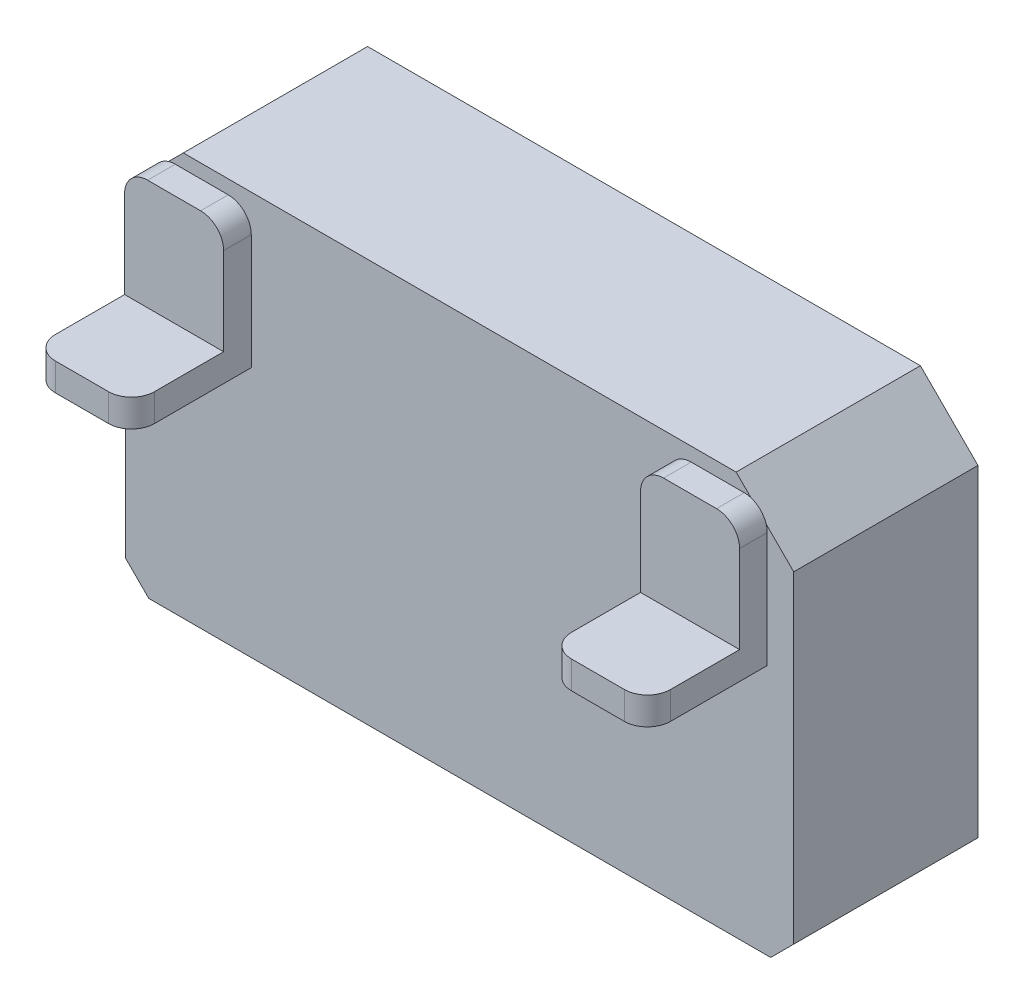
ISO-10303-21;
HEADER;
FILE_DESCRIPTION(('STEP AP214'),'2;1');
FILE_NAME('part.step','',(''),(''),'','','');
FILE_SCHEMA(('AUTOMOTIVE_DESIGN { 1 0 10303 214 1 1 1 1 }'));
ENDSEC;
DATA;
#1=APPLICATION_CONTEXT('core data for automotive mechanical design processes');
#2=APPLICATION_PROTOCOL_DEFINITION('international standard','automotive_design',2000,#1);
#3=PRODUCT_CONTEXT('',#1,'mechanical');
#4=PRODUCT('Part','Part','',(#3));
#5=PRODUCT_RELATED_PRODUCT_CATEGORY('part','',(#4));
#6=PRODUCT_DEFINITION_FORMATION('','',#4);
#7=PRODUCT_DEFINITION_CONTEXT('part definition',#1,'design');
#8=PRODUCT_DEFINITION('design','',#6,#7);
#9=PRODUCT_DEFINITION_SHAPE('','',#8);
#10=(LENGTH_UNIT() NAMED_UNIT(*) SI_UNIT(.MILLI.,.METRE.));
#11=(NAMED_UNIT(*) PLANE_ANGLE_UNIT() SI_UNIT($,.RADIAN.));
#12=(NAMED_UNIT(*) SI_UNIT($,.STERADIAN.) SOLID_ANGLE_UNIT());
#13=UNCERTAINTY_MEASURE_WITH_UNIT(LENGTH_MEASURE(1.E-05),#10,'distance_accuracy_value','');
#14=(GEOMETRIC_REPRESENTATION_CONTEXT(3) GLOBAL_UNCERTAINTY_ASSIGNED_CONTEXT((#13)) GLOBAL_UNIT_ASSIGNED_CONTEXT((#10,
#11,#12)) REPRESENTATION_CONTEXT('',''));
#15=CARTESIAN_POINT('',(0.,0.,0.));
#16=DIRECTION('',(0.,0.,1.));
#17=DIRECTION('',(1.,0.,0.));
#18=AXIS2_PLACEMENT_3D('',#15,#16,#17);
#19=CARTESIAN_POINT('',(0.,0.,92.));
#20=DIRECTION('',(0.,0.,-1.));
#21=DIRECTION('',(-1.,0.,0.));
#22=AXIS2_PLACEMENT_3D('',#19,#20,#21);
#23=PLANE('',#22);
#24=DIRECTION('',(0.,1.,0.));
#25=VECTOR('',#24,1.);
#26=CARTESIAN_POINT('',(133.5,81.4999999999999,92.));
#27=LINE('',#26,#25);
#28=CARTESIAN_POINT('',(133.5,33.4999999999999,92.));
#29=VERTEX_POINT('',#28);
#30=CARTESIAN_POINT('',(133.5,71.5,92.));
#31=VERTEX_POINT('',#30);
#32=EDGE_CURVE('E255',#29,#31,#27,.T.);
#33=ORIENTED_EDGE('',*,*,#32,.T.);
#34=CARTESIAN_POINT('',(123.5,71.5,92.));
#35=DIRECTION('',(0.,0.,-1.));
#36=DIRECTION('',(-1.,0.,0.));
#37=AXIS2_PLACEMENT_3D('',#34,#35,#36);
#38=CIRCLE('',#37,10.);
#39=CARTESIAN_POINT('',(123.5,81.4999999999999,92.));
#40=VERTEX_POINT('',#39);
#41=EDGE_CURVE('E396',#31,#40,#38,.F.);
#42=ORIENTED_EDGE('',*,*,#41,.T.);
#43=DIRECTION('',(-1.,0.,0.));
#44=VECTOR('',#43,1.);
#45=CARTESIAN_POINT('',(133.5,81.4999999999999,92.));
#46=LINE('',#45,#44);
#47=CARTESIAN_POINT('',(100.5,81.4999999999999,92.));
#48=VERTEX_POINT('',#47);
#49=EDGE_CURVE('E256',#40,#48,#46,.T.);
#50=ORIENTED_EDGE('',*,*,#49,.T.);
#51=CARTESIAN_POINT('',(100.5,71.5,92.));
#52=DIRECTION('',(0.,0.,-1.));
#53=DIRECTION('',(-1.,0.,0.));
#54=AXIS2_PLACEMENT_3D('',#51,#52,#53);
#55=CIRCLE('',#54,10.);
#56=CARTESIAN_POINT('',(90.5000000000001,71.5,92.));
#57=VERTEX_POINT('',#56);
#58=EDGE_CURVE('E254',#48,#57,#55,.F.);
#59=ORIENTED_EDGE('',*,*,#58,.T.);
#60=DIRECTION('',(0.,-1.,0.));
#61=VECTOR('',#60,1.);
#62=CARTESIAN_POINT('',(90.5,21.5,92.));
#63=LINE('',#62,#61);
#64=CARTESIAN_POINT('',(90.5,33.4999999999999,92.));
#65=VERTEX_POINT('',#64);
#66=EDGE_CURVE('E236',#57,#65,#63,.T.);
#67=ORIENTED_EDGE('',*,*,#66,.T.);
#68=DIRECTION('',(-1.,0.,0.));
#69=VECTOR('',#68,1.);
#70=CARTESIAN_POINT('',(90.5,33.4999999999999,92.));
#71=LINE('',#70,#69);
#72=EDGE_CURVE('E250',#29,#65,#71,.T.);
#73=ORIENTED_EDGE('',*,*,#72,.F.);
#74=EDGE_LOOP('',(#33,#42,#50,#59,#67,#73));
#75=FACE_BOUND('',#74,.T.);
#76=ADVANCED_FACE('F35',(#75),#23,.F.);
#77=CARTESIAN_POINT('',(0.,0.,80.));
#78=DIRECTION('',(0.,0.,1.));
#79=DIRECTION('',(1.,0.,0.));
#80=AXIS2_PLACEMENT_3D('',#77,#78,#79);
#81=PLANE('',#80);
#82=DIRECTION('',(0.,-1.,0.));
#83=VECTOR('',#82,1.);
#84=CARTESIAN_POINT('',(90.5,21.5,80.));
#85=LINE('',#84,#83);
#86=CARTESIAN_POINT('',(90.5000000000001,71.5,80.));
#87=VERTEX_POINT('',#86);
#88=CARTESIAN_POINT('',(90.5,21.5,80.));
#89=VERTEX_POINT('',#88);
#90=EDGE_CURVE('E281',#87,#89,#85,.T.);
#91=ORIENTED_EDGE('',*,*,#90,.F.);
#92=CARTESIAN_POINT('',(100.5,71.5,80.));
#93=DIRECTION('',(0.,0.,1.));
#94=DIRECTION('',(1.,0.,0.));
#95=AXIS2_PLACEMENT_3D('',#92,#93,#94);
#96=CIRCLE('',#95,10.);
#97=CARTESIAN_POINT('',(100.5,81.4999999999999,80.));
#98=VERTEX_POINT('',#97);
#99=EDGE_CURVE('E454',#87,#98,#96,.F.);
#100=ORIENTED_EDGE('',*,*,#99,.T.);
#101=DIRECTION('',(1.,0.,0.));
#102=VECTOR('',#101,1.);
#103=CARTESIAN_POINT('',(0.,81.4999999999999,80.));
#104=LINE('',#103,#102);
#105=CARTESIAN_POINT('',(123.5,81.4999999999999,80.));
#106=VERTEX_POINT('',#105);
#107=EDGE_CURVE('E312',#98,#106,#104,.T.);
#108=ORIENTED_EDGE('',*,*,#107,.T.);
#109=CARTESIAN_POINT('',(123.5,71.5,80.));
#110=DIRECTION('',(0.,0.,1.));
#111=DIRECTION('',(1.,0.,0.));
#112=AXIS2_PLACEMENT_3D('',#109,#110,#111);
#113=CIRCLE('',#112,10.);
#114=CARTESIAN_POINT('',(126.442810861169,81.0571891388307,80.));
#115=VERTEX_POINT('',#114);
#116=EDGE_CURVE('E449',#106,#115,#113,.F.);
#117=ORIENTED_EDGE('',*,*,#116,.T.);
#118=DIRECTION('',(-0.707106781186547,0.707106781186548,0.));
#119=VECTOR('',#118,1.);
#120=CARTESIAN_POINT('',(120.,87.5,80.));
#121=LINE('',#120,#119);
#122=CARTESIAN_POINT('',(120.,87.5,80.));
#123=VERTEX_POINT('',#122);
#124=EDGE_CURVE('E335',#115,#123,#121,.T.);
#125=ORIENTED_EDGE('',*,*,#124,.T.);
#126=DIRECTION('',(-1.,0.,0.));
#127=VECTOR('',#126,1.);
#128=CARTESIAN_POINT('',(-120.,87.5,80.));
#129=LINE('',#128,#127);
#130=CARTESIAN_POINT('',(-120.,87.5,80.));
#131=VERTEX_POINT('',#130);
#132=EDGE_CURVE('E338',#123,#131,#129,.T.);
#133=ORIENTED_EDGE('',*,*,#132,.T.);
#134=DIRECTION('',(-0.707106781186547,-0.707106781186548,0.));
#135=VECTOR('',#134,1.);
#136=CARTESIAN_POINT('',(-145.,62.5,80.));
#137=LINE('',#136,#135);
#138=CARTESIAN_POINT('',(-126.442810861169,81.0571891388307,80.));
#139=VERTEX_POINT('',#138);
#140=EDGE_CURVE('E57',#131,#139,#137,.T.);
#141=ORIENTED_EDGE('',*,*,#140,.T.);
#142=CARTESIAN_POINT('',(-123.5,71.5,80.));
#143=DIRECTION('',(0.,0.,1.));
#144=DIRECTION('',(1.,0.,0.));
#145=AXIS2_PLACEMENT_3D('',#142,#143,#144);
#146=CIRCLE('',#145,10.);
#147=CARTESIAN_POINT('',(-123.5,81.5,80.));
#148=VERTEX_POINT('',#147);
#149=EDGE_CURVE('E11',#139,#148,#146,.F.);
#150=ORIENTED_EDGE('',*,*,#149,.T.);
#151=DIRECTION('',(-1.,0.,0.));
#152=VECTOR('',#151,1.);
#153=CARTESIAN_POINT('',(-133.5,81.4999999999999,80.));
#154=LINE('',#153,#152);
#155=CARTESIAN_POINT('',(-100.5,81.5,80.));
#156=VERTEX_POINT('',#155);
#157=EDGE_CURVE('E296',#156,#148,#154,.T.);
#158=ORIENTED_EDGE('',*,*,#157,.F.);
#159=CARTESIAN_POINT('',(-100.5,71.5,80.));
#160=DIRECTION('',(0.,0.,1.));
#161=DIRECTION('',(1.,0.,0.));
#162=AXIS2_PLACEMENT_3D('',#159,#160,#161);
#163=CIRCLE('',#162,10.);
#164=CARTESIAN_POINT('',(-90.5000000000001,71.5,80.));
#165=VERTEX_POINT('',#164);
#166=EDGE_CURVE('E456',#156,#165,#163,.F.);
#167=ORIENTED_EDGE('',*,*,#166,.T.);
#168=DIRECTION('',(0.,1.,0.));
#169=VECTOR('',#168,1.);
#170=CARTESIAN_POINT('',(-90.5,21.5,80.));
#171=LINE('',#170,#169);
#172=CARTESIAN_POINT('',(-90.5,21.5,80.));
#173=VERTEX_POINT('',#172);
#174=EDGE_CURVE('E301',#173,#165,#171,.T.);
#175=ORIENTED_EDGE('',*,*,#174,.F.);
#176=DIRECTION('',(1.,0.,0.));
#177=VECTOR('',#176,1.);
#178=CARTESIAN_POINT('',(-133.5,21.5,80.));
#179=LINE('',#178,#177);
#180=CARTESIAN_POINT('',(-133.5,21.5,80.));
#181=VERTEX_POINT('',#180);
#182=EDGE_CURVE('E309',#181,#173,#179,.T.);
#183=ORIENTED_EDGE('',*,*,#182,.F.);
#184=DIRECTION('',(0.,-1.,0.));
#185=VECTOR('',#184,1.);
#186=CARTESIAN_POINT('',(-133.5,81.4999999999999,80.));
#187=LINE('',#186,#185);
#188=CARTESIAN_POINT('',(-133.5,71.5,80.));
#189=VERTEX_POINT('',#188);
#190=EDGE_CURVE('E310',#189,#181,#187,.T.);
#191=ORIENTED_EDGE('',*,*,#190,.F.);
#192=CARTESIAN_POINT('',(-123.5,71.5,80.));
#193=DIRECTION('',(0.,0.,1.));
#194=DIRECTION('',(1.,0.,0.));
#195=AXIS2_PLACEMENT_3D('',#192,#193,#194);
#196=CIRCLE('',#195,10.);
#197=CARTESIAN_POINT('',(-133.057189138831,74.4428108611694,80.));
#198=VERTEX_POINT('',#197);
#199=EDGE_CURVE('E43',#189,#198,#196,.F.);
#200=ORIENTED_EDGE('',*,*,#199,.T.);
#201=CARTESIAN_POINT('',(-145.,62.5,80.));
#202=VERTEX_POINT('',#201);
#203=EDGE_CURVE('E50',#198,#202,#137,.T.);
#204=ORIENTED_EDGE('',*,*,#203,.T.);
#205=DIRECTION('',(0.,-1.,0.));
#206=VECTOR('',#205,1.);
#207=CARTESIAN_POINT('',(-145.,62.5,80.));
#208=LINE('',#207,#206);
#209=CARTESIAN_POINT('',(-145.,-77.5,80.));
#210=VERTEX_POINT('',#209);
#211=EDGE_CURVE('E323',#202,#210,#208,.T.);
#212=ORIENTED_EDGE('',*,*,#211,.T.);
#213=DIRECTION('',(0.707106781186548,-0.707106781186547,0.));
#214=VECTOR('',#213,1.);
#215=CARTESIAN_POINT('',(-145.,-77.5,80.));
#216=LINE('',#215,#214);
#217=CARTESIAN_POINT('',(-135.,-87.5,80.));
#218=VERTEX_POINT('',#217);
#219=EDGE_CURVE('E326',#210,#218,#216,.T.);
#220=ORIENTED_EDGE('',*,*,#219,.T.);
#221=DIRECTION('',(1.,0.,0.));
#222=VECTOR('',#221,1.);
#223=CARTESIAN_POINT('',(-135.,-87.5,80.));
#224=LINE('',#223,#222);
#225=CARTESIAN_POINT('',(135.,-87.5,80.));
#226=VERTEX_POINT('',#225);
#227=EDGE_CURVE('E329',#218,#226,#224,.T.);
#228=ORIENTED_EDGE('',*,*,#227,.T.);
#229=DIRECTION('',(0.707106781186548,0.707106781186547,0.));
#230=VECTOR('',#229,1.);
#231=CARTESIAN_POINT('',(135.,-87.5,80.));
#232=LINE('',#231,#230);
#233=CARTESIAN_POINT('',(145.,-77.5,80.));
#234=VERTEX_POINT('',#233);
#235=EDGE_CURVE('E331',#226,#234,#232,.T.);
#236=ORIENTED_EDGE('',*,*,#235,.T.);
#237=DIRECTION('',(0.,1.,0.));
#238=VECTOR('',#237,1.);
#239=CARTESIAN_POINT('',(145.,62.5,80.));
#240=LINE('',#239,#238);
#241=CARTESIAN_POINT('',(145.,62.5,80.));
#242=VERTEX_POINT('',#241);
#243=EDGE_CURVE('E333',#234,#242,#240,.T.);
#244=ORIENTED_EDGE('',*,*,#243,.T.);
#245=CARTESIAN_POINT('',(133.057189138831,74.4428108611693,80.));
#246=VERTEX_POINT('',#245);
#247=EDGE_CURVE('E336',#242,#246,#121,.T.);
#248=ORIENTED_EDGE('',*,*,#247,.T.);
#249=CARTESIAN_POINT('',(123.5,71.5,80.));
#250=DIRECTION('',(0.,0.,1.));
#251=DIRECTION('',(1.,0.,0.));
#252=AXIS2_PLACEMENT_3D('',#249,#250,#251);
#253=CIRCLE('',#252,10.);
#254=CARTESIAN_POINT('',(133.5,71.5,80.));
#255=VERTEX_POINT('',#254);
#256=EDGE_CURVE('E452',#246,#255,#253,.F.);
#257=ORIENTED_EDGE('',*,*,#256,.T.);
#258=DIRECTION('',(0.,1.,0.));
#259=VECTOR('',#258,1.);
#260=CARTESIAN_POINT('',(133.5,81.4999999999999,80.));
#261=LINE('',#260,#259);
#262=CARTESIAN_POINT('',(133.5,21.5,80.));
#263=VERTEX_POINT('',#262);
#264=EDGE_CURVE('E282',#263,#255,#261,.T.);
#265=ORIENTED_EDGE('',*,*,#264,.F.);
#266=DIRECTION('',(1.,0.,0.));
#267=VECTOR('',#266,1.);
#268=CARTESIAN_POINT('',(133.5,21.5,80.));
#269=LINE('',#268,#267);
#270=EDGE_CURVE('E288',#89,#263,#269,.T.);
#271=ORIENTED_EDGE('',*,*,#270,.F.);
#272=EDGE_LOOP('',(#91,#100,#108,#117,#125,#133,#141,#150,#158,#167,#175,#183,#191,#200,#204,
#212,#220,#228,#236,#244,#248,#257,#265,#271));
#273=FACE_BOUND('',#272,.T.);
#274=ADVANCED_FACE('F460',(#273),#81,.T.);
#275=CARTESIAN_POINT('',(-145.,62.5,80.));
#276=DIRECTION('',(1.,0.,0.));
#277=DIRECTION('',(0.,1.,0.));
#278=AXIS2_PLACEMENT_3D('',#275,#276,#277);
#279=PLANE('',#278);
#280=DIRECTION('',(0.,-1.,0.));
#281=VECTOR('',#280,1.);
#282=CARTESIAN_POINT('',(-145.,62.5,0.));
#283=LINE('',#282,#281);
#284=CARTESIAN_POINT('',(-145.,62.5,0.));
#285=VERTEX_POINT('',#284);
#286=CARTESIAN_POINT('',(-145.,-77.5,0.));
#287=VERTEX_POINT('',#286);
#288=EDGE_CURVE('E322',#285,#287,#283,.T.);
#289=ORIENTED_EDGE('',*,*,#288,.T.);
#290=DIRECTION('',(0.,0.,-1.));
#291=VECTOR('',#290,1.);
#292=CARTESIAN_POINT('',(-145.,-77.5,80.));
#293=LINE('',#292,#291);
#294=EDGE_CURVE('E313',#210,#287,#293,.T.);
#295=ORIENTED_EDGE('',*,*,#294,.F.);
#296=ORIENTED_EDGE('',*,*,#211,.F.);
#297=DIRECTION('',(0.,0.,-1.));
#298=VECTOR('',#297,1.);
#299=CARTESIAN_POINT('',(-145.,62.5,80.));
#300=LINE('',#299,#298);
#301=EDGE_CURVE('E342',#202,#285,#300,.T.);
#302=ORIENTED_EDGE('',*,*,#301,.T.);
#303=EDGE_LOOP('',(#289,#295,#296,#302));
#304=FACE_BOUND('',#303,.T.);
#305=ADVANCED_FACE('F529',(#304),#279,.F.);
#306=CARTESIAN_POINT('',(-145.,-77.5,80.));
#307=DIRECTION('',(0.707106781186547,0.707106781186548,0.));
#308=DIRECTION('',(-0.707106781186548,0.707106781186547,0.));
#309=AXIS2_PLACEMENT_3D('',#306,#307,#308);
#310=PLANE('',#309);
#311=DIRECTION('',(0.707106781186548,-0.707106781186547,0.));
#312=VECTOR('',#311,1.);
#313=CARTESIAN_POINT('',(-145.,-77.5,0.));
#314=LINE('',#313,#312);
#315=CARTESIAN_POINT('',(-135.,-87.5,0.));
#316=VERTEX_POINT('',#315);
#317=EDGE_CURVE('E346',#287,#316,#314,.T.);
#318=ORIENTED_EDGE('',*,*,#317,.T.);
#319=DIRECTION('',(0.,0.,-1.));
#320=VECTOR('',#319,1.);
#321=CARTESIAN_POINT('',(-135.,-87.5,80.));
#322=LINE('',#321,#320);
#323=EDGE_CURVE('E376',#218,#316,#322,.T.);
#324=ORIENTED_EDGE('',*,*,#323,.F.);
#325=ORIENTED_EDGE('',*,*,#219,.F.);
#326=ORIENTED_EDGE('',*,*,#294,.T.);
#327=EDGE_LOOP('',(#318,#324,#325,#326));
#328=FACE_BOUND('',#327,.T.);
#329=ADVANCED_FACE('F819',(#328),#310,.F.);
#330=CARTESIAN_POINT('',(-135.,-87.5,80.));
#331=DIRECTION('',(0.,1.,0.));
#332=DIRECTION('',(0.,0.,1.));
#333=AXIS2_PLACEMENT_3D('',#330,#331,#332);
#334=PLANE('',#333);
#335=DIRECTION('',(1.,0.,0.));
#336=VECTOR('',#335,1.);
#337=CARTESIAN_POINT('',(-135.,-87.5,0.));
#338=LINE('',#337,#336);
#339=CARTESIAN_POINT('',(135.,-87.5,0.));
#340=VERTEX_POINT('',#339);
#341=EDGE_CURVE('E348',#316,#340,#338,.T.);
#342=ORIENTED_EDGE('',*,*,#341,.T.);
#343=DIRECTION('',(0.,0.,-1.));
#344=VECTOR('',#343,1.);
#345=CARTESIAN_POINT('',(135.,-87.5,80.));
#346=LINE('',#345,#344);
#347=EDGE_CURVE('E373',#226,#340,#346,.T.);
#348=ORIENTED_EDGE('',*,*,#347,.F.);
#349=ORIENTED_EDGE('',*,*,#227,.F.);
#350=ORIENTED_EDGE('',*,*,#323,.T.);
#351=EDGE_LOOP('',(#342,#348,#349,#350));
#352=FACE_BOUND('',#351,.T.);
#353=ADVANCED_FACE('F809',(#352),#334,.F.);
#354=CARTESIAN_POINT('',(135.,-87.5,80.));
#355=DIRECTION('',(-0.707106781186547,0.707106781186548,0.));
#356=DIRECTION('',(-0.707106781186548,-0.707106781186547,0.));
#357=AXIS2_PLACEMENT_3D('',#354,#355,#356);
#358=PLANE('',#357);
#359=DIRECTION('',(0.707106781186548,0.707106781186547,0.));
#360=VECTOR('',#359,1.);
#361=CARTESIAN_POINT('',(135.,-87.5,0.));
#362=LINE('',#361,#360);
#363=CARTESIAN_POINT('',(145.,-77.5,0.));
#364=VERTEX_POINT('',#363);
#365=EDGE_CURVE('E350',#340,#364,#362,.T.);
#366=ORIENTED_EDGE('',*,*,#365,.T.);
#367=DIRECTION('',(0.,0.,-1.));
#368=VECTOR('',#367,1.);
#369=CARTESIAN_POINT('',(145.,-77.5,80.));
#370=LINE('',#369,#368);
#371=EDGE_CURVE('E370',#234,#364,#370,.T.);
#372=ORIENTED_EDGE('',*,*,#371,.F.);
#373=ORIENTED_EDGE('',*,*,#235,.F.);
#374=ORIENTED_EDGE('',*,*,#347,.T.);
#375=EDGE_LOOP('',(#366,#372,#373,#374));
#376=FACE_BOUND('',#375,.T.);
#377=ADVANCED_FACE('F799',(#376),#358,.F.);
#378=CARTESIAN_POINT('',(145.,62.5,80.));
#379=DIRECTION('',(-1.,0.,0.));
#380=DIRECTION('',(0.,0.,1.));
#381=AXIS2_PLACEMENT_3D('',#378,#379,#380);
#382=PLANE('',#381);
#383=DIRECTION('',(0.,1.,0.));
#384=VECTOR('',#383,1.);
#385=CARTESIAN_POINT('',(145.,62.5,0.));
#386=LINE('',#385,#384);
#387=CARTESIAN_POINT('',(145.,62.5,0.));
#388=VERTEX_POINT('',#387);
#389=EDGE_CURVE('E352',#364,#388,#386,.T.);
#390=ORIENTED_EDGE('',*,*,#389,.T.);
#391=DIRECTION('',(0.,0.,-1.));
#392=VECTOR('',#391,1.);
#393=CARTESIAN_POINT('',(145.,62.5,80.));
#394=LINE('',#393,#392);
#395=EDGE_CURVE('E367',#242,#388,#394,.T.);
#396=ORIENTED_EDGE('',*,*,#395,.F.);
#397=ORIENTED_EDGE('',*,*,#243,.F.);
#398=ORIENTED_EDGE('',*,*,#371,.T.);
#399=EDGE_LOOP('',(#390,#396,#397,#398));
#400=FACE_BOUND('',#399,.T.);
#401=ADVANCED_FACE('F767',(#400),#382,.F.);
#402=CARTESIAN_POINT('',(120.,87.5,80.));
#403=DIRECTION('',(-0.707106781186548,-0.707106781186547,0.));
#404=DIRECTION('',(0.707106781186547,-0.707106781186548,0.));
#405=AXIS2_PLACEMENT_3D('',#402,#403,#404);
#406=PLANE('',#405);
#407=DIRECTION('',(-0.707106781186547,0.707106781186548,0.));
#408=VECTOR('',#407,1.);
#409=CARTESIAN_POINT('',(120.,87.5,0.));
#410=LINE('',#409,#408);
#411=CARTESIAN_POINT('',(120.,87.5,0.));
#412=VERTEX_POINT('',#411);
#413=EDGE_CURVE('E354',#388,#412,#410,.T.);
#414=ORIENTED_EDGE('',*,*,#413,.T.);
#415=DIRECTION('',(0.,0.,-1.));
#416=VECTOR('',#415,1.);
#417=CARTESIAN_POINT('',(120.,87.5,80.));
#418=LINE('',#417,#416);
#419=EDGE_CURVE('E364',#123,#412,#418,.T.);
#420=ORIENTED_EDGE('',*,*,#419,.F.);
#421=ORIENTED_EDGE('',*,*,#124,.F.);
#422=EDGE_CURVE('E339',#246,#115,#121,.T.);
#423=ORIENTED_EDGE('',*,*,#422,.F.);
#424=ORIENTED_EDGE('',*,*,#247,.F.);
#425=ORIENTED_EDGE('',*,*,#395,.T.);
#426=EDGE_LOOP('',(#414,#420,#421,#423,#424,#425));
#427=FACE_BOUND('',#426,.T.);
#428=ADVANCED_FACE('F562',(#427),#406,.F.);
#429=CARTESIAN_POINT('',(-120.,87.5,80.));
#430=DIRECTION('',(0.,-1.,0.));
#431=DIRECTION('',(0.,0.,-1.));
#432=AXIS2_PLACEMENT_3D('',#429,#430,#431);
#433=PLANE('',#432);
#434=DIRECTION('',(-1.,0.,0.));
#435=VECTOR('',#434,1.);
#436=CARTESIAN_POINT('',(-120.,87.5,0.));
#437=LINE('',#436,#435);
#438=CARTESIAN_POINT('',(-120.,87.5,0.));
#439=VERTEX_POINT('',#438);
#440=EDGE_CURVE('E356',#412,#439,#437,.T.);
#441=ORIENTED_EDGE('',*,*,#440,.T.);
#442=DIRECTION('',(0.,0.,-1.));
#443=VECTOR('',#442,1.);
#444=CARTESIAN_POINT('',(-120.,87.5,80.));
#445=LINE('',#444,#443);
#446=EDGE_CURVE('E361',#131,#439,#445,.T.);
#447=ORIENTED_EDGE('',*,*,#446,.F.);
#448=ORIENTED_EDGE('',*,*,#132,.F.);
#449=ORIENTED_EDGE('',*,*,#419,.T.);
#450=EDGE_LOOP('',(#441,#447,#448,#449));
#451=FACE_BOUND('',#450,.T.);
#452=ADVANCED_FACE('F755',(#451),#433,.F.);
#453=CARTESIAN_POINT('',(-145.,62.5,80.));
#454=DIRECTION('',(0.707106781186548,-0.707106781186547,0.));
#455=DIRECTION('',(0.707106781186547,0.707106781186548,0.));
#456=AXIS2_PLACEMENT_3D('',#453,#454,#455);
#457=PLANE('',#456);
#458=DIRECTION('',(-0.707106781186547,-0.707106781186548,0.));
#459=VECTOR('',#458,1.);
#460=CARTESIAN_POINT('',(-145.,62.5,0.));
#461=LINE('',#460,#459);
#462=EDGE_CURVE('E327',#439,#285,#461,.T.);
#463=ORIENTED_EDGE('',*,*,#462,.T.);
#464=ORIENTED_EDGE('',*,*,#301,.F.);
#465=ORIENTED_EDGE('',*,*,#203,.F.);
#466=EDGE_CURVE('E343',#139,#198,#137,.T.);
#467=ORIENTED_EDGE('',*,*,#466,.F.);
#468=ORIENTED_EDGE('',*,*,#140,.F.);
#469=ORIENTED_EDGE('',*,*,#446,.T.);
#470=EDGE_LOOP('',(#463,#464,#465,#467,#468,#469));
#471=FACE_BOUND('',#470,.T.);
#472=ADVANCED_FACE('F750',(#471),#457,.F.);
#473=CARTESIAN_POINT('',(0.,0.,0.));
#474=DIRECTION('',(0.,0.,1.));
#475=DIRECTION('',(1.,0.,0.));
#476=AXIS2_PLACEMENT_3D('',#473,#474,#475);
#477=PLANE('',#476);
#478=ORIENTED_EDGE('',*,*,#288,.F.);
#479=ORIENTED_EDGE('',*,*,#462,.F.);
#480=ORIENTED_EDGE('',*,*,#440,.F.);
#481=ORIENTED_EDGE('',*,*,#413,.F.);
#482=ORIENTED_EDGE('',*,*,#389,.F.);
#483=ORIENTED_EDGE('',*,*,#365,.F.);
#484=ORIENTED_EDGE('',*,*,#341,.F.);
#485=ORIENTED_EDGE('',*,*,#317,.F.);
#486=EDGE_LOOP('',(#478,#479,#480,#481,#482,#483,#484,#485));
#487=FACE_BOUND('',#486,.T.);
#488=ADVANCED_FACE('F744',(#487),#477,.F.);
#489=CARTESIAN_POINT('',(0.,0.,80.));
#490=DIRECTION('',(0.,0.,1.));
#491=DIRECTION('',(1.,0.,0.));
#492=AXIS2_PLACEMENT_3D('',#489,#490,#491);
#493=PLANE('',#492);
#494=ORIENTED_EDGE('',*,*,#466,.T.);
#495=CARTESIAN_POINT('',(-123.5,71.5,80.));
#496=DIRECTION('',(0.,0.,1.));
#497=DIRECTION('',(1.,0.,0.));
#498=AXIS2_PLACEMENT_3D('',#495,#496,#497);
#499=CIRCLE('',#498,10.);
#500=EDGE_CURVE('E447',#198,#139,#499,.F.);
#501=ORIENTED_EDGE('',*,*,#500,.T.);
#502=EDGE_LOOP('',(#494,#501));
#503=FACE_BOUND('',#502,.T.);
#504=ADVANCED_FACE('F466',(#503),#493,.F.);
#505=CARTESIAN_POINT('',(-133.5,81.4999999999999,92.));
#506=DIRECTION('',(0.,-1.,0.));
#507=DIRECTION('',(1.,0.,0.));
#508=AXIS2_PLACEMENT_3D('',#505,#506,#507);
#509=PLANE('',#508);
#510=DIRECTION('',(-1.,0.,0.));
#511=VECTOR('',#510,1.);
#512=CARTESIAN_POINT('',(-133.5,81.4999999999999,92.));
#513=LINE('',#512,#511);
#514=CARTESIAN_POINT('',(-100.5,81.5,92.));
#515=VERTEX_POINT('',#514);
#516=CARTESIAN_POINT('',(-123.5,81.5,92.));
#517=VERTEX_POINT('',#516);
#518=EDGE_CURVE('E297',#515,#517,#513,.T.);
#519=ORIENTED_EDGE('',*,*,#518,.F.);
#520=DIRECTION('',(0.,0.,-1.));
#521=VECTOR('',#520,1.);
#522=CARTESIAN_POINT('',(-100.5,81.5,92.));
#523=LINE('',#522,#521);
#524=EDGE_CURVE('E440',#515,#156,#523,.T.);
#525=ORIENTED_EDGE('',*,*,#524,.T.);
#526=ORIENTED_EDGE('',*,*,#157,.T.);
#527=DIRECTION('',(0.,0.,-1.));
#528=VECTOR('',#527,1.);
#529=CARTESIAN_POINT('',(-123.5,81.5,92.));
#530=LINE('',#529,#528);
#531=EDGE_CURVE('E438',#148,#517,#530,.F.);
#532=ORIENTED_EDGE('',*,*,#531,.T.);
#533=EDGE_LOOP('',(#519,#525,#526,#532));
#534=FACE_BOUND('',#533,.T.);
#535=ADVANCED_FACE('F473',(#534),#509,.F.);
#536=CARTESIAN_POINT('',(-133.5,81.4999999999999,92.));
#537=DIRECTION('',(1.,0.,0.));
#538=DIRECTION('',(0.,0.,-1.));
#539=AXIS2_PLACEMENT_3D('',#536,#537,#538);
#540=PLANE('',#539);
#541=DIRECTION('',(0.,0.,-1.));
#542=VECTOR('',#541,1.);
#543=CARTESIAN_POINT('',(-133.5,21.5,92.));
#544=LINE('',#543,#542);
#545=CARTESIAN_POINT('',(-133.5,21.5,122.));
#546=VERTEX_POINT('',#545);
#547=EDGE_CURVE('E319',#546,#181,#544,.T.);
#548=ORIENTED_EDGE('',*,*,#547,.F.);
#549=DIRECTION('',(0.,-1.,0.));
#550=VECTOR('',#549,1.);
#551=CARTESIAN_POINT('',(-133.5,81.4999999999999,122.));
#552=LINE('',#551,#550);
#553=CARTESIAN_POINT('',(-133.5,33.4999999999999,122.));
#554=VERTEX_POINT('',#553);
#555=EDGE_CURVE('E414',#546,#554,#552,.F.);
#556=ORIENTED_EDGE('',*,*,#555,.T.);
#557=DIRECTION('',(0.,0.,-1.));
#558=VECTOR('',#557,1.);
#559=CARTESIAN_POINT('',(-133.5,33.4999999999999,132.));
#560=LINE('',#559,#558);
#561=CARTESIAN_POINT('',(-133.5,33.4999999999999,92.));
#562=VERTEX_POINT('',#561);
#563=EDGE_CURVE('E274',#554,#562,#560,.T.);
#564=ORIENTED_EDGE('',*,*,#563,.T.);
#565=DIRECTION('',(0.,-1.,0.));
#566=VECTOR('',#565,1.);
#567=CARTESIAN_POINT('',(-133.5,81.4999999999999,92.));
#568=LINE('',#567,#566);
#569=CARTESIAN_POINT('',(-133.5,71.5,92.));
#570=VERTEX_POINT('',#569);
#571=EDGE_CURVE('E300',#570,#562,#568,.T.);
#572=ORIENTED_EDGE('',*,*,#571,.F.);
#573=DIRECTION('',(0.,0.,-1.));
#574=VECTOR('',#573,1.);
#575=CARTESIAN_POINT('',(-133.5,71.5,92.));
#576=LINE('',#575,#574);
#577=EDGE_CURVE('E411',#570,#189,#576,.T.);
#578=ORIENTED_EDGE('',*,*,#577,.T.);
#579=ORIENTED_EDGE('',*,*,#190,.T.);
#580=EDGE_LOOP('',(#548,#556,#564,#572,#578,#579));
#581=FACE_BOUND('',#580,.T.);
#582=ADVANCED_FACE('F506',(#581),#540,.F.);
#583=CARTESIAN_POINT('',(-133.5,21.5,92.));
#584=DIRECTION('',(0.,1.,0.));
#585=DIRECTION('',(-1.,0.,0.));
#586=AXIS2_PLACEMENT_3D('',#583,#584,#585);
#587=PLANE('',#586);
#588=DIRECTION('',(1.,0.,0.));
#589=VECTOR('',#588,1.);
#590=CARTESIAN_POINT('',(-133.5,21.5,132.));
#591=LINE('',#590,#589);
#592=CARTESIAN_POINT('',(-123.5,21.5,132.));
#593=VERTEX_POINT('',#592);
#594=CARTESIAN_POINT('',(-100.5,21.5,132.));
#595=VERTEX_POINT('',#594);
#596=EDGE_CURVE('E268',#593,#595,#591,.T.);
#597=ORIENTED_EDGE('',*,*,#596,.F.);
#598=CARTESIAN_POINT('',(-123.5,21.5,122.));
#599=DIRECTION('',(0.,1.,0.));
#600=DIRECTION('',(-1.,0.,0.));
#601=AXIS2_PLACEMENT_3D('',#598,#599,#600);
#602=CIRCLE('',#601,10.);
#603=EDGE_CURVE('E409',#593,#546,#602,.F.);
#604=ORIENTED_EDGE('',*,*,#603,.T.);
#605=ORIENTED_EDGE('',*,*,#547,.T.);
#606=ORIENTED_EDGE('',*,*,#182,.T.);
#607=DIRECTION('',(0.,0.,-1.));
#608=VECTOR('',#607,1.);
#609=CARTESIAN_POINT('',(-90.5,21.5,92.));
#610=LINE('',#609,#608);
#611=CARTESIAN_POINT('',(-90.5,21.5,122.));
#612=VERTEX_POINT('',#611);
#613=EDGE_CURVE('E306',#612,#173,#610,.T.);
#614=ORIENTED_EDGE('',*,*,#613,.F.);
#615=CARTESIAN_POINT('',(-100.5,21.5,122.));
#616=DIRECTION('',(0.,1.,0.));
#617=DIRECTION('',(-1.,0.,0.));
#618=AXIS2_PLACEMENT_3D('',#615,#616,#617);
#619=CIRCLE('',#618,10.);
#620=EDGE_CURVE('E407',#612,#595,#619,.F.);
#621=ORIENTED_EDGE('',*,*,#620,.T.);
#622=EDGE_LOOP('',(#597,#604,#605,#606,#614,#621));
#623=FACE_BOUND('',#622,.T.);
#624=ADVANCED_FACE('F489',(#623),#587,.F.);
#625=CARTESIAN_POINT('',(-90.5,21.5,92.));
#626=DIRECTION('',(-1.,0.,0.));
#627=DIRECTION('',(0.,-1.,0.));
#628=AXIS2_PLACEMENT_3D('',#625,#626,#627);
#629=PLANE('',#628);
#630=DIRECTION('',(0.,0.,-1.));
#631=VECTOR('',#630,1.);
#632=CARTESIAN_POINT('',(-90.5,33.4999999999999,132.));
#633=LINE('',#632,#631);
#634=CARTESIAN_POINT('',(-90.5,33.4999999999999,122.));
#635=VERTEX_POINT('',#634);
#636=CARTESIAN_POINT('',(-90.5,33.4999999999999,92.));
#637=VERTEX_POINT('',#636);
#638=EDGE_CURVE('E279',#635,#637,#633,.T.);
#639=ORIENTED_EDGE('',*,*,#638,.F.);
#640=DIRECTION('',(0.,1.,0.));
#641=VECTOR('',#640,1.);
#642=CARTESIAN_POINT('',(-90.5,21.5,122.));
#643=LINE('',#642,#641);
#644=EDGE_CURVE('E422',#635,#612,#643,.F.);
#645=ORIENTED_EDGE('',*,*,#644,.T.);
#646=ORIENTED_EDGE('',*,*,#613,.T.);
#647=ORIENTED_EDGE('',*,*,#174,.T.);
#648=DIRECTION('',(0.,0.,-1.));
#649=VECTOR('',#648,1.);
#650=CARTESIAN_POINT('',(-90.5000000000001,71.5,92.));
#651=LINE('',#650,#649);
#652=CARTESIAN_POINT('',(-90.5000000000001,71.5,92.));
#653=VERTEX_POINT('',#652);
#654=EDGE_CURVE('E420',#165,#653,#651,.F.);
#655=ORIENTED_EDGE('',*,*,#654,.T.);
#656=DIRECTION('',(0.,1.,0.));
#657=VECTOR('',#656,1.);
#658=CARTESIAN_POINT('',(-90.5,21.5,92.));
#659=LINE('',#658,#657);
#660=EDGE_CURVE('E303',#637,#653,#659,.T.);
#661=ORIENTED_EDGE('',*,*,#660,.F.);
#662=EDGE_LOOP('',(#639,#645,#646,#647,#655,#661));
#663=FACE_BOUND('',#662,.T.);
#664=ADVANCED_FACE('F482',(#663),#629,.F.);
#665=CARTESIAN_POINT('',(0.,0.,92.));
#666=DIRECTION('',(0.,0.,1.));
#667=DIRECTION('',(1.,0.,0.));
#668=AXIS2_PLACEMENT_3D('',#665,#666,#667);
#669=PLANE('',#668);
#670=ORIENTED_EDGE('',*,*,#660,.T.);
#671=CARTESIAN_POINT('',(-100.5,71.5,92.));
#672=DIRECTION('',(0.,0.,1.));
#673=DIRECTION('',(1.,0.,0.));
#674=AXIS2_PLACEMENT_3D('',#671,#672,#673);
#675=CIRCLE('',#674,10.);
#676=EDGE_CURVE('E445',#653,#515,#675,.T.);
#677=ORIENTED_EDGE('',*,*,#676,.T.);
#678=ORIENTED_EDGE('',*,*,#518,.T.);
#679=CARTESIAN_POINT('',(-123.5,71.5,92.));
#680=DIRECTION('',(0.,0.,1.));
#681=DIRECTION('',(1.,0.,0.));
#682=AXIS2_PLACEMENT_3D('',#679,#680,#681);
#683=CIRCLE('',#682,10.);
#684=EDGE_CURVE('E443',#517,#570,#683,.T.);
#685=ORIENTED_EDGE('',*,*,#684,.T.);
#686=ORIENTED_EDGE('',*,*,#571,.T.);
#687=DIRECTION('',(-1.,0.,0.));
#688=VECTOR('',#687,1.);
#689=CARTESIAN_POINT('',(-133.5,33.4999999999999,92.));
#690=LINE('',#689,#688);
#691=EDGE_CURVE('E267',#637,#562,#690,.T.);
#692=ORIENTED_EDGE('',*,*,#691,.F.);
#693=EDGE_LOOP('',(#670,#677,#678,#685,#686,#692));
#694=FACE_BOUND('',#693,.T.);
#695=ADVANCED_FACE('F509',(#694),#669,.T.);
#696=CARTESIAN_POINT('',(0.,0.,80.));
#697=DIRECTION('',(0.,0.,-1.));
#698=DIRECTION('',(-1.,0.,0.));
#699=AXIS2_PLACEMENT_3D('',#696,#697,#698);
#700=PLANE('',#699);
#701=ORIENTED_EDGE('',*,*,#422,.T.);
#702=CARTESIAN_POINT('',(123.5,71.5,80.));
#703=DIRECTION('',(0.,0.,-1.));
#704=DIRECTION('',(-1.,0.,0.));
#705=AXIS2_PLACEMENT_3D('',#702,#703,#704);
#706=CIRCLE('',#705,10.);
#707=EDGE_CURVE('E388',#115,#246,#706,.T.);
#708=ORIENTED_EDGE('',*,*,#707,.T.);
#709=EDGE_LOOP('',(#701,#708));
#710=FACE_BOUND('',#709,.T.);
#711=ADVANCED_FACE('F512',(#710),#700,.T.);
#712=CARTESIAN_POINT('',(133.5,81.4999999999999,92.));
#713=DIRECTION('',(0.,-1.,0.));
#714=DIRECTION('',(0.,0.,-1.));
#715=AXIS2_PLACEMENT_3D('',#712,#713,#714);
#716=PLANE('',#715);
#717=ORIENTED_EDGE('',*,*,#49,.F.);
#718=DIRECTION('',(0.,0.,-1.));
#719=VECTOR('',#718,1.);
#720=CARTESIAN_POINT('',(123.5,81.4999999999999,92.));
#721=LINE('',#720,#719);
#722=EDGE_CURVE('E385',#40,#106,#721,.T.);
#723=ORIENTED_EDGE('',*,*,#722,.T.);
#724=ORIENTED_EDGE('',*,*,#107,.F.);
#725=DIRECTION('',(0.,0.,-1.));
#726=VECTOR('',#725,1.);
#727=CARTESIAN_POINT('',(100.5,81.4999999999999,92.));
#728=LINE('',#727,#726);
#729=EDGE_CURVE('E383',#98,#48,#728,.F.);
#730=ORIENTED_EDGE('',*,*,#729,.T.);
#731=EDGE_LOOP('',(#717,#723,#724,#730));
#732=FACE_BOUND('',#731,.T.);
#733=ADVANCED_FACE('F518',(#732),#716,.F.);
#734=CARTESIAN_POINT('',(90.5,21.5,92.));
#735=DIRECTION('',(1.,0.,0.));
#736=DIRECTION('',(0.,1.,0.));
#737=AXIS2_PLACEMENT_3D('',#734,#735,#736);
#738=PLANE('',#737);
#739=ORIENTED_EDGE('',*,*,#66,.F.);
#740=DIRECTION('',(0.,0.,-1.));
#741=VECTOR('',#740,1.);
#742=CARTESIAN_POINT('',(90.5000000000001,71.5,92.));
#743=LINE('',#742,#741);
#744=EDGE_CURVE('E399',#57,#87,#743,.T.);
#745=ORIENTED_EDGE('',*,*,#744,.T.);
#746=ORIENTED_EDGE('',*,*,#90,.T.);
#747=DIRECTION('',(0.,0.,-1.));
#748=VECTOR('',#747,1.);
#749=CARTESIAN_POINT('',(90.5,21.5,92.));
#750=LINE('',#749,#748);
#751=CARTESIAN_POINT('',(90.5,21.5,122.));
#752=VERTEX_POINT('',#751);
#753=EDGE_CURVE('E294',#752,#89,#750,.T.);
#754=ORIENTED_EDGE('',*,*,#753,.F.);
#755=DIRECTION('',(0.,-1.,0.));
#756=VECTOR('',#755,1.);
#757=CARTESIAN_POINT('',(90.5,21.5,122.));
#758=LINE('',#757,#756);
#759=CARTESIAN_POINT('',(90.5,33.4999999999999,122.));
#760=VERTEX_POINT('',#759);
#761=EDGE_CURVE('E240',#752,#760,#758,.F.);
#762=ORIENTED_EDGE('',*,*,#761,.T.);
#763=DIRECTION('',(0.,0.,-1.));
#764=VECTOR('',#763,1.);
#765=CARTESIAN_POINT('',(90.5,33.4999999999999,132.));
#766=LINE('',#765,#764);
#767=EDGE_CURVE('E232',#760,#65,#766,.T.);
#768=ORIENTED_EDGE('',*,*,#767,.T.);
#769=EDGE_LOOP('',(#739,#745,#746,#754,#762,#768));
#770=FACE_BOUND('',#769,.T.);
#771=ADVANCED_FACE('F234',(#770),#738,.F.);
#772=CARTESIAN_POINT('',(133.5,21.5,92.));
#773=DIRECTION('',(0.,1.,0.));
#774=DIRECTION('',(0.,0.,1.));
#775=AXIS2_PLACEMENT_3D('',#772,#773,#774);
#776=PLANE('',#775);
#777=DIRECTION('',(1.,0.,0.));
#778=VECTOR('',#777,1.);
#779=CARTESIAN_POINT('',(90.5,21.5,132.));
#780=LINE('',#779,#778);
#781=CARTESIAN_POINT('',(100.5,21.5,132.));
#782=VERTEX_POINT('',#781);
#783=CARTESIAN_POINT('',(123.5,21.5,132.));
#784=VERTEX_POINT('',#783);
#785=EDGE_CURVE('E260',#782,#784,#780,.T.);
#786=ORIENTED_EDGE('',*,*,#785,.F.);
#787=CARTESIAN_POINT('',(100.5,21.5,122.));
#788=DIRECTION('',(0.,1.,0.));
#789=DIRECTION('',(0.,0.,1.));
#790=AXIS2_PLACEMENT_3D('',#787,#788,#789);
#791=CIRCLE('',#790,10.);
#792=EDGE_CURVE('E432',#782,#752,#791,.F.);
#793=ORIENTED_EDGE('',*,*,#792,.T.);
#794=ORIENTED_EDGE('',*,*,#753,.T.);
#795=ORIENTED_EDGE('',*,*,#270,.T.);
#796=DIRECTION('',(0.,0.,-1.));
#797=VECTOR('',#796,1.);
#798=CARTESIAN_POINT('',(133.5,21.5,92.));
#799=LINE('',#798,#797);
#800=CARTESIAN_POINT('',(133.5,21.5,122.));
#801=VERTEX_POINT('',#800);
#802=EDGE_CURVE('E285',#801,#263,#799,.T.);
#803=ORIENTED_EDGE('',*,*,#802,.F.);
#804=CARTESIAN_POINT('',(123.5,21.5,122.));
#805=DIRECTION('',(0.,1.,0.));
#806=DIRECTION('',(0.,0.,1.));
#807=AXIS2_PLACEMENT_3D('',#804,#805,#806);
#808=CIRCLE('',#807,10.);
#809=EDGE_CURVE('E430',#801,#784,#808,.F.);
#810=ORIENTED_EDGE('',*,*,#809,.T.);
#811=EDGE_LOOP('',(#786,#793,#794,#795,#803,#810));
#812=FACE_BOUND('',#811,.T.);
#813=ADVANCED_FACE('F537',(#812),#776,.F.);
#814=CARTESIAN_POINT('',(133.5,81.4999999999999,92.));
#815=DIRECTION('',(-1.,0.,0.));
#816=DIRECTION('',(0.,-1.,0.));
#817=AXIS2_PLACEMENT_3D('',#814,#815,#816);
#818=PLANE('',#817);
#819=ORIENTED_EDGE('',*,*,#264,.T.);
#820=DIRECTION('',(0.,0.,-1.));
#821=VECTOR('',#820,1.);
#822=CARTESIAN_POINT('',(133.5,71.5,92.));
#823=LINE('',#822,#821);
#824=EDGE_CURVE('E393',#255,#31,#823,.F.);
#825=ORIENTED_EDGE('',*,*,#824,.T.);
#826=ORIENTED_EDGE('',*,*,#32,.F.);
#827=DIRECTION('',(0.,0.,-1.));
#828=VECTOR('',#827,1.);
#829=CARTESIAN_POINT('',(133.5,33.4999999999999,132.));
#830=LINE('',#829,#828);
#831=CARTESIAN_POINT('',(133.5,33.4999999999999,122.));
#832=VERTEX_POINT('',#831);
#833=EDGE_CURVE('E244',#832,#29,#830,.T.);
#834=ORIENTED_EDGE('',*,*,#833,.F.);
#835=DIRECTION('',(0.,1.,0.));
#836=VECTOR('',#835,1.);
#837=CARTESIAN_POINT('',(133.5,81.4999999999999,122.));
#838=LINE('',#837,#836);
#839=EDGE_CURVE('E391',#832,#801,#838,.F.);
#840=ORIENTED_EDGE('',*,*,#839,.T.);
#841=ORIENTED_EDGE('',*,*,#802,.T.);
#842=EDGE_LOOP('',(#819,#825,#826,#834,#840,#841));
#843=FACE_BOUND('',#842,.T.);
#844=ADVANCED_FACE('F534',(#843),#818,.F.);
#845=CARTESIAN_POINT('',(-133.5,33.4999999999999,132.));
#846=DIRECTION('',(0.,-1.,0.));
#847=DIRECTION('',(0.,0.,-1.));
#848=AXIS2_PLACEMENT_3D('',#845,#846,#847);
#849=PLANE('',#848);
#850=ORIENTED_EDGE('',*,*,#563,.F.);
#851=CARTESIAN_POINT('',(-123.5,33.4999999999999,122.));
#852=DIRECTION('',(0.,-1.,0.));
#853=DIRECTION('',(0.,0.,-1.));
#854=AXIS2_PLACEMENT_3D('',#851,#852,#853);
#855=CIRCLE('',#854,10.);
#856=CARTESIAN_POINT('',(-123.5,33.4999999999999,132.));
#857=VERTEX_POINT('',#856);
#858=EDGE_CURVE('E418',#554,#857,#855,.F.);
#859=ORIENTED_EDGE('',*,*,#858,.T.);
#860=DIRECTION('',(-1.,0.,0.));
#861=VECTOR('',#860,1.);
#862=CARTESIAN_POINT('',(-133.5,33.4999999999999,132.));
#863=LINE('',#862,#861);
#864=CARTESIAN_POINT('',(-100.5,33.4999999999999,132.));
#865=VERTEX_POINT('',#864);
#866=EDGE_CURVE('E271',#865,#857,#863,.T.);
#867=ORIENTED_EDGE('',*,*,#866,.F.);
#868=CARTESIAN_POINT('',(-100.5,33.4999999999999,122.));
#869=DIRECTION('',(0.,-1.,0.));
#870=DIRECTION('',(0.,0.,-1.));
#871=AXIS2_PLACEMENT_3D('',#868,#869,#870);
#872=CIRCLE('',#871,10.);
#873=EDGE_CURVE('E416',#865,#635,#872,.F.);
#874=ORIENTED_EDGE('',*,*,#873,.T.);
#875=ORIENTED_EDGE('',*,*,#638,.T.);
#876=ORIENTED_EDGE('',*,*,#691,.T.);
#877=EDGE_LOOP('',(#850,#859,#867,#874,#875,#876));
#878=FACE_BOUND('',#877,.T.);
#879=ADVANCED_FACE('F499',(#878),#849,.F.);
#880=CARTESIAN_POINT('',(0.,0.,132.));
#881=DIRECTION('',(0.,0.,-1.));
#882=DIRECTION('',(-1.,0.,0.));
#883=AXIS2_PLACEMENT_3D('',#880,#881,#882);
#884=PLANE('',#883);
#885=ORIENTED_EDGE('',*,*,#866,.T.);
#886=DIRECTION('',(0.,-1.,0.));
#887=VECTOR('',#886,1.);
#888=CARTESIAN_POINT('',(-123.5,0.,132.));
#889=LINE('',#888,#887);
#890=EDGE_CURVE('E404',#857,#593,#889,.T.);
#891=ORIENTED_EDGE('',*,*,#890,.T.);
#892=ORIENTED_EDGE('',*,*,#596,.T.);
#893=DIRECTION('',(0.,1.,0.));
#894=VECTOR('',#893,1.);
#895=CARTESIAN_POINT('',(-100.5,-2.32452945780892E-13,132.));
#896=LINE('',#895,#894);
#897=EDGE_CURVE('E401',#595,#865,#896,.T.);
#898=ORIENTED_EDGE('',*,*,#897,.T.);
#899=EDGE_LOOP('',(#885,#891,#892,#898));
#900=FACE_BOUND('',#899,.T.);
#901=ADVANCED_FACE('F495',(#900),#884,.F.);
#902=CARTESIAN_POINT('',(90.5,33.4999999999999,132.));
#903=DIRECTION('',(0.,-1.,0.));
#904=DIRECTION('',(1.,0.,0.));
#905=AXIS2_PLACEMENT_3D('',#902,#903,#904);
#906=PLANE('',#905);
#907=ORIENTED_EDGE('',*,*,#767,.F.);
#908=CARTESIAN_POINT('',(100.5,33.4999999999999,122.));
#909=DIRECTION('',(0.,-1.,0.));
#910=DIRECTION('',(1.,0.,0.));
#911=AXIS2_PLACEMENT_3D('',#908,#909,#910);
#912=CIRCLE('',#911,10.);
#913=CARTESIAN_POINT('',(100.5,33.4999999999999,132.));
#914=VERTEX_POINT('',#913);
#915=EDGE_CURVE('E436',#760,#914,#912,.F.);
#916=ORIENTED_EDGE('',*,*,#915,.T.);
#917=DIRECTION('',(-1.,0.,0.));
#918=VECTOR('',#917,1.);
#919=CARTESIAN_POINT('',(90.5,33.4999999999999,132.));
#920=LINE('',#919,#918);
#921=CARTESIAN_POINT('',(123.5,33.4999999999999,132.));
#922=VERTEX_POINT('',#921);
#923=EDGE_CURVE('E245',#922,#914,#920,.T.);
#924=ORIENTED_EDGE('',*,*,#923,.F.);
#925=CARTESIAN_POINT('',(123.5,33.4999999999999,122.));
#926=DIRECTION('',(0.,-1.,0.));
#927=DIRECTION('',(1.,0.,0.));
#928=AXIS2_PLACEMENT_3D('',#925,#926,#927);
#929=CIRCLE('',#928,10.);
#930=EDGE_CURVE('E434',#922,#832,#929,.F.);
#931=ORIENTED_EDGE('',*,*,#930,.T.);
#932=ORIENTED_EDGE('',*,*,#833,.T.);
#933=ORIENTED_EDGE('',*,*,#72,.T.);
#934=EDGE_LOOP('',(#907,#916,#924,#931,#932,#933));
#935=FACE_BOUND('',#934,.T.);
#936=ADVANCED_FACE('F258',(#935),#906,.F.);
#937=CARTESIAN_POINT('',(0.,0.,132.));
#938=DIRECTION('',(0.,0.,-1.));
#939=DIRECTION('',(-1.,0.,0.));
#940=AXIS2_PLACEMENT_3D('',#937,#938,#939);
#941=PLANE('',#940);
#942=ORIENTED_EDGE('',*,*,#923,.T.);
#943=DIRECTION('',(0.,-1.,0.));
#944=VECTOR('',#943,1.);
#945=CARTESIAN_POINT('',(100.5,-1.62717062046624E-13,132.));
#946=LINE('',#945,#944);
#947=EDGE_CURVE('E427',#914,#782,#946,.T.);
#948=ORIENTED_EDGE('',*,*,#947,.T.);
#949=ORIENTED_EDGE('',*,*,#785,.T.);
#950=DIRECTION('',(0.,1.,0.));
#951=VECTOR('',#950,1.);
#952=CARTESIAN_POINT('',(123.5,1.14260452951006E-13,132.));
#953=LINE('',#952,#951);
#954=EDGE_CURVE('E424',#784,#922,#953,.T.);
#955=ORIENTED_EDGE('',*,*,#954,.T.);
#956=EDGE_LOOP('',(#942,#948,#949,#955));
#957=FACE_BOUND('',#956,.T.);
#958=ADVANCED_FACE('F578',(#957),#941,.F.);
#959=CARTESIAN_POINT('',(123.5,71.5,92.));
#960=DIRECTION('',(0.,0.,-1.));
#961=DIRECTION('',(-1.,0.,0.));
#962=AXIS2_PLACEMENT_3D('',#959,#960,#961);
#963=CYLINDRICAL_SURFACE('',#962,10.);
#964=ORIENTED_EDGE('',*,*,#41,.F.);
#965=ORIENTED_EDGE('',*,*,#824,.F.);
#966=ORIENTED_EDGE('',*,*,#256,.F.);
#967=ORIENTED_EDGE('',*,*,#707,.F.);
#968=ORIENTED_EDGE('',*,*,#116,.F.);
#969=ORIENTED_EDGE('',*,*,#722,.F.);
#970=EDGE_LOOP('',(#964,#965,#966,#967,#968,#969));
#971=FACE_BOUND('',#970,.T.);
#972=ADVANCED_FACE('F553',(#971),#963,.T.);
#973=CARTESIAN_POINT('',(100.5,71.5,92.));
#974=DIRECTION('',(0.,0.,-1.));
#975=DIRECTION('',(-1.,0.,0.));
#976=AXIS2_PLACEMENT_3D('',#973,#974,#975);
#977=CYLINDRICAL_SURFACE('',#976,10.);
#978=ORIENTED_EDGE('',*,*,#58,.F.);
#979=ORIENTED_EDGE('',*,*,#729,.F.);
#980=ORIENTED_EDGE('',*,*,#99,.F.);
#981=ORIENTED_EDGE('',*,*,#744,.F.);
#982=EDGE_LOOP('',(#978,#979,#980,#981));
#983=FACE_BOUND('',#982,.T.);
#984=ADVANCED_FACE('F570',(#983),#977,.T.);
#985=CARTESIAN_POINT('',(-123.5,0.,122.));
#986=DIRECTION('',(0.,-1.,0.));
#987=DIRECTION('',(0.,0.,-1.));
#988=AXIS2_PLACEMENT_3D('',#985,#986,#987);
#989=CYLINDRICAL_SURFACE('',#988,10.);
#990=ORIENTED_EDGE('',*,*,#858,.F.);
#991=ORIENTED_EDGE('',*,*,#555,.F.);
#992=ORIENTED_EDGE('',*,*,#603,.F.);
#993=ORIENTED_EDGE('',*,*,#890,.F.);
#994=EDGE_LOOP('',(#990,#991,#992,#993));
#995=FACE_BOUND('',#994,.T.);
#996=ADVANCED_FACE('F503',(#995),#989,.T.);
#997=CARTESIAN_POINT('',(-100.5,-2.32452945780892E-13,122.));
#998=DIRECTION('',(0.,1.,0.));
#999=DIRECTION('',(-1.,0.,0.));
#1000=AXIS2_PLACEMENT_3D('',#997,#998,#999);
#1001=CYLINDRICAL_SURFACE('',#1000,10.);
#1002=ORIENTED_EDGE('',*,*,#620,.F.);
#1003=ORIENTED_EDGE('',*,*,#644,.F.);
#1004=ORIENTED_EDGE('',*,*,#873,.F.);
#1005=ORIENTED_EDGE('',*,*,#897,.F.);
#1006=EDGE_LOOP('',(#1002,#1003,#1004,#1005));
#1007=FACE_BOUND('',#1006,.T.);
#1008=ADVANCED_FACE('F492',(#1007),#1001,.T.);
#1009=CARTESIAN_POINT('',(100.5,-1.62717062046624E-13,122.));
#1010=DIRECTION('',(0.,-1.,0.));
#1011=DIRECTION('',(1.,0.,0.));
#1012=AXIS2_PLACEMENT_3D('',#1009,#1010,#1011);
#1013=CYLINDRICAL_SURFACE('',#1012,10.);
#1014=ORIENTED_EDGE('',*,*,#915,.F.);
#1015=ORIENTED_EDGE('',*,*,#761,.F.);
#1016=ORIENTED_EDGE('',*,*,#792,.F.);
#1017=ORIENTED_EDGE('',*,*,#947,.F.);
#1018=EDGE_LOOP('',(#1014,#1015,#1016,#1017));
#1019=FACE_BOUND('',#1018,.T.);
#1020=ADVANCED_FACE('F584',(#1019),#1013,.T.);
#1021=CARTESIAN_POINT('',(123.5,1.14260452951006E-13,122.));
#1022=DIRECTION('',(0.,1.,0.));
#1023=DIRECTION('',(-1.,0.,0.));
#1024=AXIS2_PLACEMENT_3D('',#1021,#1022,#1023);
#1025=CYLINDRICAL_SURFACE('',#1024,10.);
#1026=ORIENTED_EDGE('',*,*,#809,.F.);
#1027=ORIENTED_EDGE('',*,*,#839,.F.);
#1028=ORIENTED_EDGE('',*,*,#930,.F.);
#1029=ORIENTED_EDGE('',*,*,#954,.F.);
#1030=EDGE_LOOP('',(#1026,#1027,#1028,#1029));
#1031=FACE_BOUND('',#1030,.T.);
#1032=ADVANCED_FACE('F587',(#1031),#1025,.T.);
#1033=CARTESIAN_POINT('',(-100.5,71.5,92.));
#1034=DIRECTION('',(0.,0.,-1.));
#1035=DIRECTION('',(-1.,0.,0.));
#1036=AXIS2_PLACEMENT_3D('',#1033,#1034,#1035);
#1037=CYLINDRICAL_SURFACE('',#1036,10.);
#1038=ORIENTED_EDGE('',*,*,#676,.F.);
#1039=ORIENTED_EDGE('',*,*,#654,.F.);
#1040=ORIENTED_EDGE('',*,*,#166,.F.);
#1041=ORIENTED_EDGE('',*,*,#524,.F.);
#1042=EDGE_LOOP('',(#1038,#1039,#1040,#1041));
#1043=FACE_BOUND('',#1042,.T.);
#1044=ADVANCED_FACE('F477',(#1043),#1037,.T.);
#1045=CARTESIAN_POINT('',(-123.5,71.5,92.));
#1046=DIRECTION('',(0.,0.,-1.));
#1047=DIRECTION('',(-1.,0.,0.));
#1048=AXIS2_PLACEMENT_3D('',#1045,#1046,#1047);
#1049=CYLINDRICAL_SURFACE('',#1048,10.);
#1050=ORIENTED_EDGE('',*,*,#684,.F.);
#1051=ORIENTED_EDGE('',*,*,#531,.F.);
#1052=ORIENTED_EDGE('',*,*,#149,.F.);
#1053=ORIENTED_EDGE('',*,*,#500,.F.);
#1054=ORIENTED_EDGE('',*,*,#199,.F.);
#1055=ORIENTED_EDGE('',*,*,#577,.F.);
#1056=EDGE_LOOP('',(#1050,#1051,#1052,#1053,#1054,#1055));
#1057=FACE_BOUND('',#1056,.T.);
#1058=ADVANCED_FACE('F37',(#1057),#1049,.T.);
#1059=CLOSED_SHELL('',(#76,#274,#305,#329,#353,#377,#401,#428,#452,#472,#488,#504,#535,#582,
#624,#664,#695,#711,#733,#771,#813,#844,#879,#901,#936,#958,#972,#984,#996,#1008,#1020,#1032,
#1044,#1058));
#1060=MANIFOLD_SOLID_BREP('B2',#1059);
#1061=ADVANCED_BREP_SHAPE_REPRESENTATION('',(#18,#1060),#14);
#1062=SHAPE_DEFINITION_REPRESENTATION(#9,#1061);
ENDSEC;
END-ISO-10303-21;
